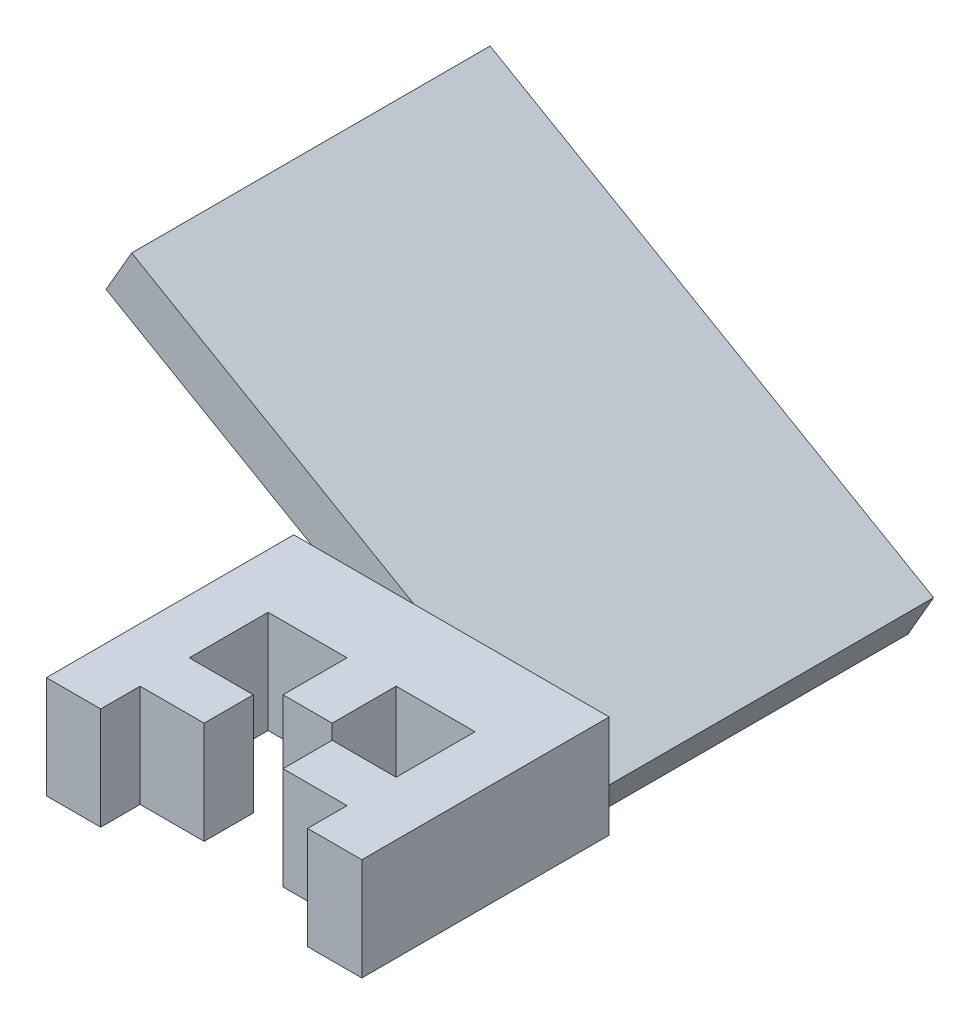
ISO-10303-21;
HEADER;
FILE_DESCRIPTION(('STEP AP214'),'2;1');
FILE_NAME('part.step','',(''),(''),'','','');
FILE_SCHEMA(('AUTOMOTIVE_DESIGN { 1 0 10303 214 1 1 1 1 }'));
ENDSEC;
DATA;
#1=APPLICATION_CONTEXT('core data for automotive mechanical design processes');
#2=APPLICATION_PROTOCOL_DEFINITION('international standard','automotive_design',2000,#1);
#3=PRODUCT_CONTEXT('',#1,'mechanical');
#4=PRODUCT('Part','Part','',(#3));
#5=PRODUCT_RELATED_PRODUCT_CATEGORY('part','',(#4));
#6=PRODUCT_DEFINITION_FORMATION('','',#4);
#7=PRODUCT_DEFINITION_CONTEXT('part definition',#1,'design');
#8=PRODUCT_DEFINITION('design','',#6,#7);
#9=PRODUCT_DEFINITION_SHAPE('','',#8);
#10=(LENGTH_UNIT() NAMED_UNIT(*) SI_UNIT(.MILLI.,.METRE.));
#11=(NAMED_UNIT(*) PLANE_ANGLE_UNIT() SI_UNIT($,.RADIAN.));
#12=(NAMED_UNIT(*) SI_UNIT($,.STERADIAN.) SOLID_ANGLE_UNIT());
#13=UNCERTAINTY_MEASURE_WITH_UNIT(LENGTH_MEASURE(1.E-05),#10,'distance_accuracy_value','');
#14=(GEOMETRIC_REPRESENTATION_CONTEXT(3) GLOBAL_UNCERTAINTY_ASSIGNED_CONTEXT((#13)) GLOBAL_UNIT_ASSIGNED_CONTEXT((#10,
#11,#12)) REPRESENTATION_CONTEXT('',''));
#15=CARTESIAN_POINT('',(0.,0.,0.));
#16=DIRECTION('',(0.,0.,1.));
#17=DIRECTION('',(1.,0.,0.));
#18=AXIS2_PLACEMENT_3D('',#15,#16,#17);
#19=CARTESIAN_POINT('',(-15.4,5.,-17.9));
#20=DIRECTION('',(0.,0.,-1.));
#21=DIRECTION('',(-1.,0.,0.));
#22=AXIS2_PLACEMENT_3D('',#19,#20,#21);
#23=PLANE('',#22);
#24=DIRECTION('',(-0.866025403784438,0.5,0.));
#25=VECTOR('',#24,1.);
#26=CARTESIAN_POINT('',(-33.7262701892219,16.59,-17.9));
#27=LINE('',#26,#25);
#28=CARTESIAN_POINT('',(3.66870674619011,-4.99999999999999,-17.9));
#29=VERTEX_POINT('',#28);
#30=CARTESIAN_POINT('',(-13.6518013294987,5.00000000000001,-17.9));
#31=VERTEX_POINT('',#30);
#32=EDGE_CURVE('E11',#29,#31,#27,.T.);
#33=ORIENTED_EDGE('',*,*,#32,.F.);
#34=DIRECTION('',(1.,0.,0.));
#35=VECTOR('',#34,1.);
#36=CARTESIAN_POINT('',(-15.4,-5.,-17.9));
#37=LINE('',#36,#35);
#38=CARTESIAN_POINT('',(-15.4,-5.,-17.9));
#39=VERTEX_POINT('',#38);
#40=EDGE_CURVE('E235',#39,#29,#37,.T.);
#41=ORIENTED_EDGE('',*,*,#40,.F.);
#42=DIRECTION('',(0.,-1.,0.));
#43=VECTOR('',#42,1.);
#44=CARTESIAN_POINT('',(-15.4,5.,-17.9));
#45=LINE('',#44,#43);
#46=CARTESIAN_POINT('',(-15.4,5.,-17.9));
#47=VERTEX_POINT('',#46);
#48=EDGE_CURVE('E242',#47,#39,#45,.T.);
#49=ORIENTED_EDGE('',*,*,#48,.F.);
#50=DIRECTION('',(1.,0.,0.));
#51=VECTOR('',#50,1.);
#52=CARTESIAN_POINT('',(-15.4,5.,-17.9));
#53=LINE('',#52,#51);
#54=EDGE_CURVE('E240',#47,#31,#53,.T.);
#55=ORIENTED_EDGE('',*,*,#54,.T.);
#56=EDGE_LOOP('',(#33,#41,#49,#55));
#57=FACE_BOUND('',#56,.T.);
#58=ADVANCED_FACE('F33',(#57),#23,.T.);
#59=CARTESIAN_POINT('',(-3.85,5.,2.4));
#60=DIRECTION('',(0.,0.,-1.));
#61=DIRECTION('',(-1.,0.,0.));
#62=AXIS2_PLACEMENT_3D('',#59,#60,#61);
#63=PLANE('',#62);
#64=DIRECTION('',(1.,0.,0.));
#65=VECTOR('',#64,1.);
#66=CARTESIAN_POINT('',(-3.85,-5.,2.4));
#67=LINE('',#66,#65);
#68=CARTESIAN_POINT('',(-10.1,-5.,2.4));
#69=VERTEX_POINT('',#68);
#70=CARTESIAN_POINT('',(-3.85,-5.,2.4));
#71=VERTEX_POINT('',#70);
#72=EDGE_CURVE('E250',#69,#71,#67,.T.);
#73=ORIENTED_EDGE('',*,*,#72,.T.);
#74=DIRECTION('',(0.,-1.,0.));
#75=VECTOR('',#74,1.);
#76=CARTESIAN_POINT('',(-3.85,5.,2.4));
#77=LINE('',#76,#75);
#78=CARTESIAN_POINT('',(-3.85,5.,2.4));
#79=VERTEX_POINT('',#78);
#80=EDGE_CURVE('E37',#79,#71,#77,.T.);
#81=ORIENTED_EDGE('',*,*,#80,.F.);
#82=DIRECTION('',(1.,0.,0.));
#83=VECTOR('',#82,1.);
#84=CARTESIAN_POINT('',(-3.85,5.,2.4));
#85=LINE('',#84,#83);
#86=CARTESIAN_POINT('',(-10.1,5.,2.4));
#87=VERTEX_POINT('',#86);
#88=EDGE_CURVE('E253',#87,#79,#85,.T.);
#89=ORIENTED_EDGE('',*,*,#88,.F.);
#90=DIRECTION('',(0.,-1.,0.));
#91=VECTOR('',#90,1.);
#92=CARTESIAN_POINT('',(-10.1,5.,2.4));
#93=LINE('',#92,#91);
#94=EDGE_CURVE('E294',#87,#69,#93,.T.);
#95=ORIENTED_EDGE('',*,*,#94,.T.);
#96=EDGE_LOOP('',(#73,#81,#89,#95));
#97=FACE_BOUND('',#96,.T.);
#98=ADVANCED_FACE('F35',(#97),#63,.F.);
#99=CARTESIAN_POINT('',(-3.85,5.,2.4));
#100=DIRECTION('',(-1.,0.,0.));
#101=DIRECTION('',(0.,0.,1.));
#102=AXIS2_PLACEMENT_3D('',#99,#100,#101);
#103=PLANE('',#102);
#104=DIRECTION('',(0.,0.,-1.));
#105=VECTOR('',#104,1.);
#106=CARTESIAN_POINT('',(-3.85,-5.,2.4));
#107=LINE('',#106,#105);
#108=CARTESIAN_POINT('',(-3.85,-5.,-2.4));
#109=VERTEX_POINT('',#108);
#110=EDGE_CURVE('E297',#71,#109,#107,.T.);
#111=ORIENTED_EDGE('',*,*,#110,.T.);
#112=DIRECTION('',(0.,-1.,0.));
#113=VECTOR('',#112,1.);
#114=CARTESIAN_POINT('',(-3.85,5.,-2.4));
#115=LINE('',#114,#113);
#116=CARTESIAN_POINT('',(-3.85,5.,-2.4));
#117=VERTEX_POINT('',#116);
#118=EDGE_CURVE('E379',#117,#109,#115,.T.);
#119=ORIENTED_EDGE('',*,*,#118,.F.);
#120=DIRECTION('',(0.,0.,-1.));
#121=VECTOR('',#120,1.);
#122=CARTESIAN_POINT('',(-3.85,5.,2.4));
#123=LINE('',#122,#121);
#124=EDGE_CURVE('E256',#79,#117,#123,.T.);
#125=ORIENTED_EDGE('',*,*,#124,.F.);
#126=ORIENTED_EDGE('',*,*,#80,.T.);
#127=EDGE_LOOP('',(#111,#119,#125,#126));
#128=FACE_BOUND('',#127,.T.);
#129=ADVANCED_FACE('F450',(#128),#103,.F.);
#130=CARTESIAN_POINT('',(-3.85,5.,-2.4));
#131=DIRECTION('',(0.,0.,1.));
#132=DIRECTION('',(1.,0.,0.));
#133=AXIS2_PLACEMENT_3D('',#130,#131,#132);
#134=PLANE('',#133);
#135=DIRECTION('',(-1.,0.,0.));
#136=VECTOR('',#135,1.);
#137=CARTESIAN_POINT('',(-3.85,-5.,-2.4));
#138=LINE('',#137,#136);
#139=CARTESIAN_POINT('',(-10.1,-5.,-2.4));
#140=VERTEX_POINT('',#139);
#141=EDGE_CURVE('E299',#109,#140,#138,.T.);
#142=ORIENTED_EDGE('',*,*,#141,.T.);
#143=DIRECTION('',(0.,-1.,0.));
#144=VECTOR('',#143,1.);
#145=CARTESIAN_POINT('',(-10.1,5.,-2.4));
#146=LINE('',#145,#144);
#147=CARTESIAN_POINT('',(-10.1,5.,-2.4));
#148=VERTEX_POINT('',#147);
#149=EDGE_CURVE('E377',#148,#140,#146,.T.);
#150=ORIENTED_EDGE('',*,*,#149,.F.);
#151=DIRECTION('',(-1.,0.,0.));
#152=VECTOR('',#151,1.);
#153=CARTESIAN_POINT('',(-3.85,5.,-2.4));
#154=LINE('',#153,#152);
#155=EDGE_CURVE('E259',#117,#148,#154,.T.);
#156=ORIENTED_EDGE('',*,*,#155,.F.);
#157=ORIENTED_EDGE('',*,*,#118,.T.);
#158=EDGE_LOOP('',(#142,#150,#156,#157));
#159=FACE_BOUND('',#158,.T.);
#160=ADVANCED_FACE('F452',(#159),#134,.F.);
#161=CARTESIAN_POINT('',(-10.1,5.,-2.4));
#162=DIRECTION('',(-1.,0.,0.));
#163=DIRECTION('',(0.,0.,1.));
#164=AXIS2_PLACEMENT_3D('',#161,#162,#163);
#165=PLANE('',#164);
#166=DIRECTION('',(0.,0.,-1.));
#167=VECTOR('',#166,1.);
#168=CARTESIAN_POINT('',(-10.1,-5.,-2.4));
#169=LINE('',#168,#167);
#170=CARTESIAN_POINT('',(-10.1,-5.,-10.1));
#171=VERTEX_POINT('',#170);
#172=EDGE_CURVE('E301',#140,#171,#169,.T.);
#173=ORIENTED_EDGE('',*,*,#172,.T.);
#174=DIRECTION('',(0.,-1.,0.));
#175=VECTOR('',#174,1.);
#176=CARTESIAN_POINT('',(-10.1,5.,-10.1));
#177=LINE('',#176,#175);
#178=CARTESIAN_POINT('',(-10.1,5.,-10.1));
#179=VERTEX_POINT('',#178);
#180=EDGE_CURVE('E374',#179,#171,#177,.T.);
#181=ORIENTED_EDGE('',*,*,#180,.F.);
#182=DIRECTION('',(0.,0.,-1.));
#183=VECTOR('',#182,1.);
#184=CARTESIAN_POINT('',(-10.1,5.,-2.4));
#185=LINE('',#184,#183);
#186=EDGE_CURVE('E261',#148,#179,#185,.T.);
#187=ORIENTED_EDGE('',*,*,#186,.F.);
#188=ORIENTED_EDGE('',*,*,#149,.T.);
#189=EDGE_LOOP('',(#173,#181,#187,#188));
#190=FACE_BOUND('',#189,.T.);
#191=ADVANCED_FACE('F458',(#190),#165,.F.);
#192=CARTESIAN_POINT('',(-10.1,5.,-10.1));
#193=DIRECTION('',(0.,0.,-1.));
#194=DIRECTION('',(-1.,0.,0.));
#195=AXIS2_PLACEMENT_3D('',#192,#193,#194);
#196=PLANE('',#195);
#197=DIRECTION('',(1.,0.,0.));
#198=VECTOR('',#197,1.);
#199=CARTESIAN_POINT('',(-10.1,-5.,-10.1));
#200=LINE('',#199,#198);
#201=CARTESIAN_POINT('',(-2.4,-5.,-10.1));
#202=VERTEX_POINT('',#201);
#203=EDGE_CURVE('E303',#171,#202,#200,.T.);
#204=ORIENTED_EDGE('',*,*,#203,.T.);
#205=DIRECTION('',(0.,-1.,0.));
#206=VECTOR('',#205,1.);
#207=CARTESIAN_POINT('',(-2.4,5.,-10.1));
#208=LINE('',#207,#206);
#209=CARTESIAN_POINT('',(-2.4,5.,-10.1));
#210=VERTEX_POINT('',#209);
#211=EDGE_CURVE('E371',#210,#202,#208,.T.);
#212=ORIENTED_EDGE('',*,*,#211,.F.);
#213=DIRECTION('',(1.,0.,0.));
#214=VECTOR('',#213,1.);
#215=CARTESIAN_POINT('',(-10.1,5.,-10.1));
#216=LINE('',#215,#214);
#217=EDGE_CURVE('E263',#179,#210,#216,.T.);
#218=ORIENTED_EDGE('',*,*,#217,.F.);
#219=ORIENTED_EDGE('',*,*,#180,.T.);
#220=EDGE_LOOP('',(#204,#212,#218,#219));
#221=FACE_BOUND('',#220,.T.);
#222=ADVANCED_FACE('F461',(#221),#196,.F.);
#223=CARTESIAN_POINT('',(-2.4,5.,-10.1));
#224=DIRECTION('',(1.,0.,0.));
#225=DIRECTION('',(0.,0.,-1.));
#226=AXIS2_PLACEMENT_3D('',#223,#224,#225);
#227=PLANE('',#226);
#228=DIRECTION('',(0.,0.,1.));
#229=VECTOR('',#228,1.);
#230=CARTESIAN_POINT('',(-2.4,-5.,-10.1));
#231=LINE('',#230,#229);
#232=CARTESIAN_POINT('',(-2.4,-5.,-3.85));
#233=VERTEX_POINT('',#232);
#234=EDGE_CURVE('E305',#202,#233,#231,.T.);
#235=ORIENTED_EDGE('',*,*,#234,.T.);
#236=DIRECTION('',(0.,-1.,0.));
#237=VECTOR('',#236,1.);
#238=CARTESIAN_POINT('',(-2.4,5.,-3.85));
#239=LINE('',#238,#237);
#240=CARTESIAN_POINT('',(-2.4,5.,-3.85));
#241=VERTEX_POINT('',#240);
#242=EDGE_CURVE('E368',#241,#233,#239,.T.);
#243=ORIENTED_EDGE('',*,*,#242,.F.);
#244=DIRECTION('',(0.,0.,1.));
#245=VECTOR('',#244,1.);
#246=CARTESIAN_POINT('',(-2.4,5.,-10.1));
#247=LINE('',#246,#245);
#248=EDGE_CURVE('E265',#210,#241,#247,.T.);
#249=ORIENTED_EDGE('',*,*,#248,.F.);
#250=ORIENTED_EDGE('',*,*,#211,.T.);
#251=EDGE_LOOP('',(#235,#243,#249,#250));
#252=FACE_BOUND('',#251,.T.);
#253=ADVANCED_FACE('F466',(#252),#227,.F.);
#254=CARTESIAN_POINT('',(-2.4,5.,-3.85));
#255=DIRECTION('',(0.,0.,-1.));
#256=DIRECTION('',(-1.,0.,0.));
#257=AXIS2_PLACEMENT_3D('',#254,#255,#256);
#258=PLANE('',#257);
#259=DIRECTION('',(1.,0.,0.));
#260=VECTOR('',#259,1.);
#261=CARTESIAN_POINT('',(-2.4,-5.,-3.85));
#262=LINE('',#261,#260);
#263=CARTESIAN_POINT('',(2.4,-5.,-3.85));
#264=VERTEX_POINT('',#263);
#265=EDGE_CURVE('E307',#233,#264,#262,.T.);
#266=ORIENTED_EDGE('',*,*,#265,.T.);
#267=DIRECTION('',(0.,-1.,0.));
#268=VECTOR('',#267,1.);
#269=CARTESIAN_POINT('',(2.4,5.,-3.85));
#270=LINE('',#269,#268);
#271=CARTESIAN_POINT('',(2.4,5.,-3.85));
#272=VERTEX_POINT('',#271);
#273=EDGE_CURVE('E365',#272,#264,#270,.T.);
#274=ORIENTED_EDGE('',*,*,#273,.F.);
#275=DIRECTION('',(1.,0.,0.));
#276=VECTOR('',#275,1.);
#277=CARTESIAN_POINT('',(-2.4,5.,-3.85));
#278=LINE('',#277,#276);
#279=EDGE_CURVE('E267',#241,#272,#278,.T.);
#280=ORIENTED_EDGE('',*,*,#279,.F.);
#281=ORIENTED_EDGE('',*,*,#242,.T.);
#282=EDGE_LOOP('',(#266,#274,#280,#281));
#283=FACE_BOUND('',#282,.T.);
#284=ADVANCED_FACE('F472',(#283),#258,.F.);
#285=CARTESIAN_POINT('',(2.4,5.,-10.1));
#286=DIRECTION('',(-1.,0.,0.));
#287=DIRECTION('',(0.,0.,1.));
#288=AXIS2_PLACEMENT_3D('',#285,#286,#287);
#289=PLANE('',#288);
#290=DIRECTION('',(0.,0.,-1.));
#291=VECTOR('',#290,1.);
#292=CARTESIAN_POINT('',(2.4,-5.,-10.1));
#293=LINE('',#292,#291);
#294=CARTESIAN_POINT('',(2.4,-5.,-10.1));
#295=VERTEX_POINT('',#294);
#296=EDGE_CURVE('E309',#264,#295,#293,.T.);
#297=ORIENTED_EDGE('',*,*,#296,.T.);
#298=DIRECTION('',(0.,-1.,0.));
#299=VECTOR('',#298,1.);
#300=CARTESIAN_POINT('',(2.4,5.,-10.1));
#301=LINE('',#300,#299);
#302=CARTESIAN_POINT('',(2.4,5.,-10.1));
#303=VERTEX_POINT('',#302);
#304=EDGE_CURVE('E362',#303,#295,#301,.T.);
#305=ORIENTED_EDGE('',*,*,#304,.F.);
#306=DIRECTION('',(0.,0.,-1.));
#307=VECTOR('',#306,1.);
#308=CARTESIAN_POINT('',(2.4,5.,-10.1));
#309=LINE('',#308,#307);
#310=EDGE_CURVE('E269',#272,#303,#309,.T.);
#311=ORIENTED_EDGE('',*,*,#310,.F.);
#312=ORIENTED_EDGE('',*,*,#273,.T.);
#313=EDGE_LOOP('',(#297,#305,#311,#312));
#314=FACE_BOUND('',#313,.T.);
#315=ADVANCED_FACE('F476',(#314),#289,.F.);
#316=CARTESIAN_POINT('',(10.1,5.,-10.1));
#317=DIRECTION('',(0.,0.,-1.));
#318=DIRECTION('',(-1.,0.,0.));
#319=AXIS2_PLACEMENT_3D('',#316,#317,#318);
#320=PLANE('',#319);
#321=DIRECTION('',(1.,0.,0.));
#322=VECTOR('',#321,1.);
#323=CARTESIAN_POINT('',(10.1,-5.,-10.1));
#324=LINE('',#323,#322);
#325=CARTESIAN_POINT('',(10.1,-5.,-10.1));
#326=VERTEX_POINT('',#325);
#327=EDGE_CURVE('E311',#295,#326,#324,.T.);
#328=ORIENTED_EDGE('',*,*,#327,.T.);
#329=DIRECTION('',(0.,-1.,0.));
#330=VECTOR('',#329,1.);
#331=CARTESIAN_POINT('',(10.1,5.,-10.1));
#332=LINE('',#331,#330);
#333=CARTESIAN_POINT('',(10.1,5.,-10.1));
#334=VERTEX_POINT('',#333);
#335=EDGE_CURVE('E359',#334,#326,#332,.T.);
#336=ORIENTED_EDGE('',*,*,#335,.F.);
#337=DIRECTION('',(1.,0.,0.));
#338=VECTOR('',#337,1.);
#339=CARTESIAN_POINT('',(10.1,5.,-10.1));
#340=LINE('',#339,#338);
#341=EDGE_CURVE('E271',#303,#334,#340,.T.);
#342=ORIENTED_EDGE('',*,*,#341,.F.);
#343=ORIENTED_EDGE('',*,*,#304,.T.);
#344=EDGE_LOOP('',(#328,#336,#342,#343));
#345=FACE_BOUND('',#344,.T.);
#346=ADVANCED_FACE('F481',(#345),#320,.F.);
#347=CARTESIAN_POINT('',(10.1,5.,-2.4));
#348=DIRECTION('',(1.,0.,0.));
#349=DIRECTION('',(0.,0.,-1.));
#350=AXIS2_PLACEMENT_3D('',#347,#348,#349);
#351=PLANE('',#350);
#352=DIRECTION('',(0.,0.,1.));
#353=VECTOR('',#352,1.);
#354=CARTESIAN_POINT('',(10.1,-5.,-2.4));
#355=LINE('',#354,#353);
#356=CARTESIAN_POINT('',(10.1,-5.,-2.4));
#357=VERTEX_POINT('',#356);
#358=EDGE_CURVE('E313',#326,#357,#355,.T.);
#359=ORIENTED_EDGE('',*,*,#358,.T.);
#360=DIRECTION('',(0.,-1.,0.));
#361=VECTOR('',#360,1.);
#362=CARTESIAN_POINT('',(10.1,5.,-2.4));
#363=LINE('',#362,#361);
#364=CARTESIAN_POINT('',(10.1,5.,-2.4));
#365=VERTEX_POINT('',#364);
#366=EDGE_CURVE('E356',#365,#357,#363,.T.);
#367=ORIENTED_EDGE('',*,*,#366,.F.);
#368=DIRECTION('',(0.,0.,1.));
#369=VECTOR('',#368,1.);
#370=CARTESIAN_POINT('',(10.1,5.,-2.4));
#371=LINE('',#370,#369);
#372=EDGE_CURVE('E273',#334,#365,#371,.T.);
#373=ORIENTED_EDGE('',*,*,#372,.F.);
#374=ORIENTED_EDGE('',*,*,#335,.T.);
#375=EDGE_LOOP('',(#359,#367,#373,#374));
#376=FACE_BOUND('',#375,.T.);
#377=ADVANCED_FACE('F487',(#376),#351,.F.);
#378=CARTESIAN_POINT('',(3.85,5.,-2.4));
#379=DIRECTION('',(0.,0.,1.));
#380=DIRECTION('',(1.,0.,0.));
#381=AXIS2_PLACEMENT_3D('',#378,#379,#380);
#382=PLANE('',#381);
#383=DIRECTION('',(-1.,0.,0.));
#384=VECTOR('',#383,1.);
#385=CARTESIAN_POINT('',(3.85,-5.,-2.4));
#386=LINE('',#385,#384);
#387=CARTESIAN_POINT('',(3.85,-5.,-2.4));
#388=VERTEX_POINT('',#387);
#389=EDGE_CURVE('E315',#357,#388,#386,.T.);
#390=ORIENTED_EDGE('',*,*,#389,.T.);
#391=DIRECTION('',(0.,-1.,0.));
#392=VECTOR('',#391,1.);
#393=CARTESIAN_POINT('',(3.85,5.,-2.4));
#394=LINE('',#393,#392);
#395=CARTESIAN_POINT('',(3.85,5.,-2.4));
#396=VERTEX_POINT('',#395);
#397=EDGE_CURVE('E353',#396,#388,#394,.T.);
#398=ORIENTED_EDGE('',*,*,#397,.F.);
#399=DIRECTION('',(-1.,0.,0.));
#400=VECTOR('',#399,1.);
#401=CARTESIAN_POINT('',(3.85,5.,-2.4));
#402=LINE('',#401,#400);
#403=EDGE_CURVE('E275',#365,#396,#402,.T.);
#404=ORIENTED_EDGE('',*,*,#403,.F.);
#405=ORIENTED_EDGE('',*,*,#366,.T.);
#406=EDGE_LOOP('',(#390,#398,#404,#405));
#407=FACE_BOUND('',#406,.T.);
#408=ADVANCED_FACE('F491',(#407),#382,.F.);
#409=CARTESIAN_POINT('',(3.85,5.,2.4));
#410=DIRECTION('',(1.,0.,0.));
#411=DIRECTION('',(0.,0.,-1.));
#412=AXIS2_PLACEMENT_3D('',#409,#410,#411);
#413=PLANE('',#412);
#414=DIRECTION('',(0.,0.,1.));
#415=VECTOR('',#414,1.);
#416=CARTESIAN_POINT('',(3.85,-5.,2.4));
#417=LINE('',#416,#415);
#418=CARTESIAN_POINT('',(3.85,-5.,2.4));
#419=VERTEX_POINT('',#418);
#420=EDGE_CURVE('E317',#388,#419,#417,.T.);
#421=ORIENTED_EDGE('',*,*,#420,.T.);
#422=DIRECTION('',(0.,-1.,0.));
#423=VECTOR('',#422,1.);
#424=CARTESIAN_POINT('',(3.85,5.,2.4));
#425=LINE('',#424,#423);
#426=CARTESIAN_POINT('',(3.85,5.,2.4));
#427=VERTEX_POINT('',#426);
#428=EDGE_CURVE('E350',#427,#419,#425,.T.);
#429=ORIENTED_EDGE('',*,*,#428,.F.);
#430=DIRECTION('',(0.,0.,1.));
#431=VECTOR('',#430,1.);
#432=CARTESIAN_POINT('',(3.85,5.,2.4));
#433=LINE('',#432,#431);
#434=EDGE_CURVE('E277',#396,#427,#433,.T.);
#435=ORIENTED_EDGE('',*,*,#434,.F.);
#436=ORIENTED_EDGE('',*,*,#397,.T.);
#437=EDGE_LOOP('',(#421,#429,#435,#436));
#438=FACE_BOUND('',#437,.T.);
#439=ADVANCED_FACE('F496',(#438),#413,.F.);
#440=CARTESIAN_POINT('',(3.85,5.,2.4));
#441=DIRECTION('',(0.,0.,-1.));
#442=DIRECTION('',(-1.,0.,0.));
#443=AXIS2_PLACEMENT_3D('',#440,#441,#442);
#444=PLANE('',#443);
#445=DIRECTION('',(1.,0.,0.));
#446=VECTOR('',#445,1.);
#447=CARTESIAN_POINT('',(3.85,-5.,2.4));
#448=LINE('',#447,#446);
#449=CARTESIAN_POINT('',(10.1,-5.,2.4));
#450=VERTEX_POINT('',#449);
#451=EDGE_CURVE('E319',#419,#450,#448,.T.);
#452=ORIENTED_EDGE('',*,*,#451,.T.);
#453=DIRECTION('',(0.,-1.,0.));
#454=VECTOR('',#453,1.);
#455=CARTESIAN_POINT('',(10.1,5.,2.4));
#456=LINE('',#455,#454);
#457=CARTESIAN_POINT('',(10.1,5.,2.4));
#458=VERTEX_POINT('',#457);
#459=EDGE_CURVE('E347',#458,#450,#456,.T.);
#460=ORIENTED_EDGE('',*,*,#459,.F.);
#461=DIRECTION('',(1.,0.,0.));
#462=VECTOR('',#461,1.);
#463=CARTESIAN_POINT('',(3.85,5.,2.4));
#464=LINE('',#463,#462);
#465=EDGE_CURVE('E279',#427,#458,#464,.T.);
#466=ORIENTED_EDGE('',*,*,#465,.F.);
#467=ORIENTED_EDGE('',*,*,#428,.T.);
#468=EDGE_LOOP('',(#452,#460,#466,#467));
#469=FACE_BOUND('',#468,.T.);
#470=ADVANCED_FACE('F502',(#469),#444,.F.);
#471=CARTESIAN_POINT('',(10.1,5.,2.4));
#472=DIRECTION('',(1.,0.,0.));
#473=DIRECTION('',(0.,0.,-1.));
#474=AXIS2_PLACEMENT_3D('',#471,#472,#473);
#475=PLANE('',#474);
#476=DIRECTION('',(0.,0.,1.));
#477=VECTOR('',#476,1.);
#478=CARTESIAN_POINT('',(10.1,-5.,2.4));
#479=LINE('',#478,#477);
#480=CARTESIAN_POINT('',(10.1,-5.,6.25));
#481=VERTEX_POINT('',#480);
#482=EDGE_CURVE('E321',#450,#481,#479,.T.);
#483=ORIENTED_EDGE('',*,*,#482,.T.);
#484=DIRECTION('',(0.,-1.,0.));
#485=VECTOR('',#484,1.);
#486=CARTESIAN_POINT('',(10.1,5.,6.25));
#487=LINE('',#486,#485);
#488=CARTESIAN_POINT('',(10.1,5.,6.25));
#489=VERTEX_POINT('',#488);
#490=EDGE_CURVE('E344',#489,#481,#487,.T.);
#491=ORIENTED_EDGE('',*,*,#490,.F.);
#492=DIRECTION('',(0.,0.,1.));
#493=VECTOR('',#492,1.);
#494=CARTESIAN_POINT('',(10.1,5.,2.4));
#495=LINE('',#494,#493);
#496=EDGE_CURVE('E281',#458,#489,#495,.T.);
#497=ORIENTED_EDGE('',*,*,#496,.F.);
#498=ORIENTED_EDGE('',*,*,#459,.T.);
#499=EDGE_LOOP('',(#483,#491,#497,#498));
#500=FACE_BOUND('',#499,.T.);
#501=ADVANCED_FACE('F505',(#500),#475,.F.);
#502=CARTESIAN_POINT('',(10.1,5.,6.25));
#503=DIRECTION('',(0.,0.,-1.));
#504=DIRECTION('',(-1.,0.,0.));
#505=AXIS2_PLACEMENT_3D('',#502,#503,#504);
#506=PLANE('',#505);
#507=DIRECTION('',(1.,0.,0.));
#508=VECTOR('',#507,1.);
#509=CARTESIAN_POINT('',(10.1,-5.,6.25));
#510=LINE('',#509,#508);
#511=CARTESIAN_POINT('',(15.4,-5.,6.25));
#512=VERTEX_POINT('',#511);
#513=EDGE_CURVE('E323',#481,#512,#510,.T.);
#514=ORIENTED_EDGE('',*,*,#513,.T.);
#515=DIRECTION('',(0.,-1.,0.));
#516=VECTOR('',#515,1.);
#517=CARTESIAN_POINT('',(15.4,5.,6.25));
#518=LINE('',#517,#516);
#519=CARTESIAN_POINT('',(15.4,5.,6.25));
#520=VERTEX_POINT('',#519);
#521=EDGE_CURVE('E341',#520,#512,#518,.T.);
#522=ORIENTED_EDGE('',*,*,#521,.F.);
#523=DIRECTION('',(1.,0.,0.));
#524=VECTOR('',#523,1.);
#525=CARTESIAN_POINT('',(10.1,5.,6.25));
#526=LINE('',#525,#524);
#527=EDGE_CURVE('E283',#489,#520,#526,.T.);
#528=ORIENTED_EDGE('',*,*,#527,.F.);
#529=ORIENTED_EDGE('',*,*,#490,.T.);
#530=EDGE_LOOP('',(#514,#522,#528,#529));
#531=FACE_BOUND('',#530,.T.);
#532=ADVANCED_FACE('F507',(#531),#506,.F.);
#533=CARTESIAN_POINT('',(15.4,5.,-15.4));
#534=DIRECTION('',(-1.,0.,0.));
#535=DIRECTION('',(0.,0.,1.));
#536=AXIS2_PLACEMENT_3D('',#533,#534,#535);
#537=PLANE('',#536);
#538=DIRECTION('',(0.,0.,-1.));
#539=VECTOR('',#538,1.);
#540=CARTESIAN_POINT('',(15.4,-5.,-15.4));
#541=LINE('',#540,#539);
#542=CARTESIAN_POINT('',(15.4,-5.,-17.9));
#543=VERTEX_POINT('',#542);
#544=EDGE_CURVE('E325',#512,#543,#541,.T.);
#545=ORIENTED_EDGE('',*,*,#544,.T.);
#546=DIRECTION('',(0.,-1.,0.));
#547=VECTOR('',#546,1.);
#548=CARTESIAN_POINT('',(15.4,5.,-17.9));
#549=LINE('',#548,#547);
#550=CARTESIAN_POINT('',(15.4,5.,-17.9));
#551=VERTEX_POINT('',#550);
#552=EDGE_CURVE('E247',#551,#543,#549,.T.);
#553=ORIENTED_EDGE('',*,*,#552,.F.);
#554=DIRECTION('',(0.,0.,-1.));
#555=VECTOR('',#554,1.);
#556=CARTESIAN_POINT('',(15.4,5.,-15.4));
#557=LINE('',#556,#555);
#558=EDGE_CURVE('E285',#520,#551,#557,.T.);
#559=ORIENTED_EDGE('',*,*,#558,.F.);
#560=ORIENTED_EDGE('',*,*,#521,.T.);
#561=EDGE_LOOP('',(#545,#553,#559,#560));
#562=FACE_BOUND('',#561,.T.);
#563=ADVANCED_FACE('F418',(#562),#537,.F.);
#564=CARTESIAN_POINT('',(-15.4,5.,-15.4));
#565=DIRECTION('',(1.,0.,0.));
#566=DIRECTION('',(0.,0.,-1.));
#567=AXIS2_PLACEMENT_3D('',#564,#565,#566);
#568=PLANE('',#567);
#569=DIRECTION('',(0.,0.,1.));
#570=VECTOR('',#569,1.);
#571=CARTESIAN_POINT('',(-15.4,-5.,-15.4));
#572=LINE('',#571,#570);
#573=CARTESIAN_POINT('',(-15.4,-5.,6.25));
#574=VERTEX_POINT('',#573);
#575=EDGE_CURVE('E328',#39,#574,#572,.T.);
#576=ORIENTED_EDGE('',*,*,#575,.T.);
#577=DIRECTION('',(0.,-1.,0.));
#578=VECTOR('',#577,1.);
#579=CARTESIAN_POINT('',(-15.4,5.,6.25));
#580=LINE('',#579,#578);
#581=CARTESIAN_POINT('',(-15.4,5.,6.25));
#582=VERTEX_POINT('',#581);
#583=EDGE_CURVE('E338',#582,#574,#580,.T.);
#584=ORIENTED_EDGE('',*,*,#583,.F.);
#585=DIRECTION('',(0.,0.,1.));
#586=VECTOR('',#585,1.);
#587=CARTESIAN_POINT('',(-15.4,5.,-15.4));
#588=LINE('',#587,#586);
#589=EDGE_CURVE('E288',#47,#582,#588,.T.);
#590=ORIENTED_EDGE('',*,*,#589,.F.);
#591=ORIENTED_EDGE('',*,*,#48,.T.);
#592=EDGE_LOOP('',(#576,#584,#590,#591));
#593=FACE_BOUND('',#592,.T.);
#594=ADVANCED_FACE('F438',(#593),#568,.F.);
#595=CARTESIAN_POINT('',(-10.1,5.,6.25));
#596=DIRECTION('',(0.,0.,-1.));
#597=DIRECTION('',(-1.,0.,0.));
#598=AXIS2_PLACEMENT_3D('',#595,#596,#597);
#599=PLANE('',#598);
#600=DIRECTION('',(1.,0.,0.));
#601=VECTOR('',#600,1.);
#602=CARTESIAN_POINT('',(-10.1,-5.,6.25));
#603=LINE('',#602,#601);
#604=CARTESIAN_POINT('',(-10.1,-5.,6.25));
#605=VERTEX_POINT('',#604);
#606=EDGE_CURVE('E330',#574,#605,#603,.T.);
#607=ORIENTED_EDGE('',*,*,#606,.T.);
#608=DIRECTION('',(0.,-1.,0.));
#609=VECTOR('',#608,1.);
#610=CARTESIAN_POINT('',(-10.1,5.,6.25));
#611=LINE('',#610,#609);
#612=CARTESIAN_POINT('',(-10.1,5.,6.25));
#613=VERTEX_POINT('',#612);
#614=EDGE_CURVE('E335',#613,#605,#611,.T.);
#615=ORIENTED_EDGE('',*,*,#614,.F.);
#616=DIRECTION('',(1.,0.,0.));
#617=VECTOR('',#616,1.);
#618=CARTESIAN_POINT('',(-10.1,5.,6.25));
#619=LINE('',#618,#617);
#620=EDGE_CURVE('E290',#582,#613,#619,.T.);
#621=ORIENTED_EDGE('',*,*,#620,.F.);
#622=ORIENTED_EDGE('',*,*,#583,.T.);
#623=EDGE_LOOP('',(#607,#615,#621,#622));
#624=FACE_BOUND('',#623,.T.);
#625=ADVANCED_FACE('F442',(#624),#599,.F.);
#626=CARTESIAN_POINT('',(-10.1,5.,2.4));
#627=DIRECTION('',(-1.,0.,0.));
#628=DIRECTION('',(0.,0.,1.));
#629=AXIS2_PLACEMENT_3D('',#626,#627,#628);
#630=PLANE('',#629);
#631=DIRECTION('',(0.,0.,-1.));
#632=VECTOR('',#631,1.);
#633=CARTESIAN_POINT('',(-10.1,-5.,2.4));
#634=LINE('',#633,#632);
#635=EDGE_CURVE('E257',#605,#69,#634,.T.);
#636=ORIENTED_EDGE('',*,*,#635,.T.);
#637=ORIENTED_EDGE('',*,*,#94,.F.);
#638=DIRECTION('',(0.,0.,-1.));
#639=VECTOR('',#638,1.);
#640=CARTESIAN_POINT('',(-10.1,5.,2.4));
#641=LINE('',#640,#639);
#642=EDGE_CURVE('E292',#613,#87,#641,.T.);
#643=ORIENTED_EDGE('',*,*,#642,.F.);
#644=ORIENTED_EDGE('',*,*,#614,.T.);
#645=EDGE_LOOP('',(#636,#637,#643,#644));
#646=FACE_BOUND('',#645,.T.);
#647=ADVANCED_FACE('F446',(#646),#630,.F.);
#648=CARTESIAN_POINT('',(0.,5.,0.));
#649=DIRECTION('',(0.,1.,0.));
#650=DIRECTION('',(0.,0.,1.));
#651=AXIS2_PLACEMENT_3D('',#648,#649,#650);
#652=PLANE('',#651);
#653=ORIENTED_EDGE('',*,*,#88,.T.);
#654=ORIENTED_EDGE('',*,*,#124,.T.);
#655=ORIENTED_EDGE('',*,*,#155,.T.);
#656=ORIENTED_EDGE('',*,*,#186,.T.);
#657=ORIENTED_EDGE('',*,*,#217,.T.);
#658=ORIENTED_EDGE('',*,*,#248,.T.);
#659=ORIENTED_EDGE('',*,*,#279,.T.);
#660=ORIENTED_EDGE('',*,*,#310,.T.);
#661=ORIENTED_EDGE('',*,*,#341,.T.);
#662=ORIENTED_EDGE('',*,*,#372,.T.);
#663=ORIENTED_EDGE('',*,*,#403,.T.);
#664=ORIENTED_EDGE('',*,*,#434,.T.);
#665=ORIENTED_EDGE('',*,*,#465,.T.);
#666=ORIENTED_EDGE('',*,*,#496,.T.);
#667=ORIENTED_EDGE('',*,*,#527,.T.);
#668=ORIENTED_EDGE('',*,*,#558,.T.);
#669=CARTESIAN_POINT('',(-3.65180132949864,5.,-17.9));
#670=VERTEX_POINT('',#669);
#671=EDGE_CURVE('E244',#670,#551,#53,.T.);
#672=ORIENTED_EDGE('',*,*,#671,.F.);
#673=EDGE_CURVE('E243',#31,#670,#53,.T.);
#674=ORIENTED_EDGE('',*,*,#673,.F.);
#675=ORIENTED_EDGE('',*,*,#54,.F.);
#676=ORIENTED_EDGE('',*,*,#589,.T.);
#677=ORIENTED_EDGE('',*,*,#620,.T.);
#678=ORIENTED_EDGE('',*,*,#642,.T.);
#679=EDGE_LOOP('',(#653,#654,#655,#656,#657,#658,#659,#660,#661,#662,#663,#664,#665,#666,#667,
#668,#672,#674,#675,#676,#677,#678));
#680=FACE_BOUND('',#679,.T.);
#681=ADVANCED_FACE('F414',(#680),#652,.T.);
#682=CARTESIAN_POINT('',(0.,-5.,0.));
#683=DIRECTION('',(0.,1.,0.));
#684=DIRECTION('',(0.,0.,1.));
#685=AXIS2_PLACEMENT_3D('',#682,#683,#684);
#686=PLANE('',#685);
#687=ORIENTED_EDGE('',*,*,#72,.F.);
#688=ORIENTED_EDGE('',*,*,#635,.F.);
#689=ORIENTED_EDGE('',*,*,#606,.F.);
#690=ORIENTED_EDGE('',*,*,#575,.F.);
#691=ORIENTED_EDGE('',*,*,#40,.T.);
#692=CARTESIAN_POINT('',(11.5437644179366,-5.,-17.9));
#693=VERTEX_POINT('',#692);
#694=EDGE_CURVE('E233',#29,#693,#37,.T.);
#695=ORIENTED_EDGE('',*,*,#694,.T.);
#696=EDGE_CURVE('E231',#693,#543,#37,.T.);
#697=ORIENTED_EDGE('',*,*,#696,.T.);
#698=ORIENTED_EDGE('',*,*,#544,.F.);
#699=ORIENTED_EDGE('',*,*,#513,.F.);
#700=ORIENTED_EDGE('',*,*,#482,.F.);
#701=ORIENTED_EDGE('',*,*,#451,.F.);
#702=ORIENTED_EDGE('',*,*,#420,.F.);
#703=ORIENTED_EDGE('',*,*,#389,.F.);
#704=ORIENTED_EDGE('',*,*,#358,.F.);
#705=ORIENTED_EDGE('',*,*,#327,.F.);
#706=ORIENTED_EDGE('',*,*,#296,.F.);
#707=ORIENTED_EDGE('',*,*,#265,.F.);
#708=ORIENTED_EDGE('',*,*,#234,.F.);
#709=ORIENTED_EDGE('',*,*,#203,.F.);
#710=ORIENTED_EDGE('',*,*,#172,.F.);
#711=ORIENTED_EDGE('',*,*,#141,.F.);
#712=ORIENTED_EDGE('',*,*,#110,.F.);
#713=EDGE_LOOP('',(#687,#688,#689,#690,#691,#695,#697,#698,#699,#700,#701,#702,#703,#704,#705,
#706,#707,#708,#709,#710,#711,#712));
#714=FACE_BOUND('',#713,.T.);
#715=ADVANCED_FACE('F423',(#714),#686,.F.);
#716=DIRECTION('',(0.866025403784439,-0.5,0.));
#717=VECTOR('',#716,1.);
#718=CARTESIAN_POINT('',(-31.2262701892219,20.9201270189222,-17.9));
#719=LINE('',#718,#717);
#720=CARTESIAN_POINT('',(12.075,-4.07987298107781,-17.9));
#721=VERTEX_POINT('',#720);
#722=EDGE_CURVE('E42',#670,#721,#719,.T.);
#723=ORIENTED_EDGE('',*,*,#722,.F.);
#724=ORIENTED_EDGE('',*,*,#671,.T.);
#725=ORIENTED_EDGE('',*,*,#552,.T.);
#726=ORIENTED_EDGE('',*,*,#696,.F.);
#727=DIRECTION('',(-0.500000000000002,-0.866025403784438,0.));
#728=VECTOR('',#727,1.);
#729=CARTESIAN_POINT('',(12.075,-4.07987298107781,-17.9));
#730=LINE('',#729,#728);
#731=EDGE_CURVE('E52',#721,#693,#730,.T.);
#732=ORIENTED_EDGE('',*,*,#731,.F.);
#733=EDGE_LOOP('',(#723,#724,#725,#726,#732));
#734=FACE_BOUND('',#733,.T.);
#735=ADVANCED_FACE('F411',(#734),#23,.T.);
#736=CARTESIAN_POINT('',(0.,0.,-17.9));
#737=DIRECTION('',(0.,0.,-1.));
#738=DIRECTION('',(-1.,0.,0.));
#739=AXIS2_PLACEMENT_3D('',#736,#737,#738);
#740=PLANE('',#739);
#741=CARTESIAN_POINT('',(-33.7262701892219,16.59,-17.9));
#742=VERTEX_POINT('',#741);
#743=EDGE_CURVE('E45',#31,#742,#27,.T.);
#744=ORIENTED_EDGE('',*,*,#743,.F.);
#745=ORIENTED_EDGE('',*,*,#673,.T.);
#746=CARTESIAN_POINT('',(-31.2262701892219,20.9201270189222,-17.9));
#747=VERTEX_POINT('',#746);
#748=EDGE_CURVE('E389',#747,#670,#719,.T.);
#749=ORIENTED_EDGE('',*,*,#748,.F.);
#750=DIRECTION('',(0.5,0.866025403784439,0.));
#751=VECTOR('',#750,1.);
#752=CARTESIAN_POINT('',(-31.2262701892219,20.9201270189222,-17.9));
#753=LINE('',#752,#751);
#754=EDGE_CURVE('E227',#742,#747,#753,.T.);
#755=ORIENTED_EDGE('',*,*,#754,.F.);
#756=EDGE_LOOP('',(#744,#745,#749,#755));
#757=FACE_BOUND('',#756,.T.);
#758=ADVANCED_FACE('F407',(#757),#740,.F.);
#759=CARTESIAN_POINT('',(-31.2262701892219,20.9201270189222,-52.9));
#760=DIRECTION('',(-0.5,-0.866025403784439,0.));
#761=DIRECTION('',(0.866025403784439,-0.5,0.));
#762=AXIS2_PLACEMENT_3D('',#759,#760,#761);
#763=PLANE('',#762);
#764=ORIENTED_EDGE('',*,*,#748,.T.);
#765=ORIENTED_EDGE('',*,*,#722,.T.);
#766=DIRECTION('',(0.,0.,1.));
#767=VECTOR('',#766,1.);
#768=CARTESIAN_POINT('',(12.075,-4.07987298107781,-52.9));
#769=LINE('',#768,#767);
#770=CARTESIAN_POINT('',(12.075,-4.07987298107781,-52.9));
#771=VERTEX_POINT('',#770);
#772=EDGE_CURVE('E212',#771,#721,#769,.T.);
#773=ORIENTED_EDGE('',*,*,#772,.F.);
#774=DIRECTION('',(0.866025403784439,-0.5,0.));
#775=VECTOR('',#774,1.);
#776=CARTESIAN_POINT('',(-31.2262701892219,20.9201270189222,-52.9));
#777=LINE('',#776,#775);
#778=CARTESIAN_POINT('',(-31.2262701892219,20.9201270189222,-52.9));
#779=VERTEX_POINT('',#778);
#780=EDGE_CURVE('E218',#779,#771,#777,.T.);
#781=ORIENTED_EDGE('',*,*,#780,.F.);
#782=DIRECTION('',(0.,0.,1.));
#783=VECTOR('',#782,1.);
#784=CARTESIAN_POINT('',(-31.2262701892219,20.9201270189222,-52.9));
#785=LINE('',#784,#783);
#786=EDGE_CURVE('E398',#779,#747,#785,.T.);
#787=ORIENTED_EDGE('',*,*,#786,.T.);
#788=EDGE_LOOP('',(#764,#765,#773,#781,#787));
#789=FACE_BOUND('',#788,.T.);
#790=ADVANCED_FACE('F230',(#789),#763,.F.);
#791=CARTESIAN_POINT('',(12.075,-4.07987298107781,-52.9));
#792=DIRECTION('',(-0.866025403784438,0.500000000000002,0.));
#793=DIRECTION('',(-0.500000000000002,-0.866025403784438,0.));
#794=AXIS2_PLACEMENT_3D('',#791,#792,#793);
#795=PLANE('',#794);
#796=ORIENTED_EDGE('',*,*,#731,.T.);
#797=CARTESIAN_POINT('',(9.575,-8.41,-17.9));
#798=VERTEX_POINT('',#797);
#799=EDGE_CURVE('E392',#693,#798,#730,.T.);
#800=ORIENTED_EDGE('',*,*,#799,.T.);
#801=DIRECTION('',(0.,0.,1.));
#802=VECTOR('',#801,1.);
#803=CARTESIAN_POINT('',(9.575,-8.41,-52.9));
#804=LINE('',#803,#802);
#805=CARTESIAN_POINT('',(9.575,-8.41,-52.9));
#806=VERTEX_POINT('',#805);
#807=EDGE_CURVE('E214',#806,#798,#804,.T.);
#808=ORIENTED_EDGE('',*,*,#807,.F.);
#809=DIRECTION('',(-0.500000000000002,-0.866025403784438,0.));
#810=VECTOR('',#809,1.);
#811=CARTESIAN_POINT('',(12.075,-4.07987298107781,-52.9));
#812=LINE('',#811,#810);
#813=EDGE_CURVE('E208',#771,#806,#812,.T.);
#814=ORIENTED_EDGE('',*,*,#813,.F.);
#815=ORIENTED_EDGE('',*,*,#772,.T.);
#816=EDGE_LOOP('',(#796,#800,#808,#814,#815));
#817=FACE_BOUND('',#816,.T.);
#818=ADVANCED_FACE('F210',(#817),#795,.F.);
#819=CARTESIAN_POINT('',(-33.7262701892219,16.59,-52.9));
#820=DIRECTION('',(0.5,0.866025403784439,0.));
#821=DIRECTION('',(-0.866025403784439,0.5,0.));
#822=AXIS2_PLACEMENT_3D('',#819,#820,#821);
#823=PLANE('',#822);
#824=EDGE_CURVE('E44',#798,#29,#27,.T.);
#825=ORIENTED_EDGE('',*,*,#824,.T.);
#826=ORIENTED_EDGE('',*,*,#32,.T.);
#827=ORIENTED_EDGE('',*,*,#743,.T.);
#828=DIRECTION('',(0.,0.,1.));
#829=VECTOR('',#828,1.);
#830=CARTESIAN_POINT('',(-33.7262701892219,16.59,-52.9));
#831=LINE('',#830,#829);
#832=CARTESIAN_POINT('',(-33.7262701892219,16.59,-52.9));
#833=VERTEX_POINT('',#832);
#834=EDGE_CURVE('E236',#833,#742,#831,.T.);
#835=ORIENTED_EDGE('',*,*,#834,.F.);
#836=DIRECTION('',(-0.866025403784438,0.5,0.));
#837=VECTOR('',#836,1.);
#838=CARTESIAN_POINT('',(-33.7262701892219,16.59,-52.9));
#839=LINE('',#838,#837);
#840=EDGE_CURVE('E217',#806,#833,#839,.T.);
#841=ORIENTED_EDGE('',*,*,#840,.F.);
#842=ORIENTED_EDGE('',*,*,#807,.T.);
#843=EDGE_LOOP('',(#825,#826,#827,#835,#841,#842));
#844=FACE_BOUND('',#843,.T.);
#845=ADVANCED_FACE('F429',(#844),#823,.F.);
#846=CARTESIAN_POINT('',(-31.2262701892219,20.9201270189222,-52.9));
#847=DIRECTION('',(0.866025403784439,-0.5,0.));
#848=DIRECTION('',(0.5,0.866025403784439,0.));
#849=AXIS2_PLACEMENT_3D('',#846,#847,#848);
#850=PLANE('',#849);
#851=ORIENTED_EDGE('',*,*,#754,.T.);
#852=ORIENTED_EDGE('',*,*,#786,.F.);
#853=DIRECTION('',(0.5,0.866025403784439,0.));
#854=VECTOR('',#853,1.);
#855=CARTESIAN_POINT('',(-31.2262701892219,20.9201270189222,-52.9));
#856=LINE('',#855,#854);
#857=EDGE_CURVE('E223',#833,#779,#856,.T.);
#858=ORIENTED_EDGE('',*,*,#857,.F.);
#859=ORIENTED_EDGE('',*,*,#834,.T.);
#860=EDGE_LOOP('',(#851,#852,#858,#859));
#861=FACE_BOUND('',#860,.T.);
#862=ADVANCED_FACE('F403',(#861),#850,.F.);
#863=CARTESIAN_POINT('',(0.,0.,-52.9));
#864=DIRECTION('',(0.,0.,-1.));
#865=DIRECTION('',(-1.,0.,0.));
#866=AXIS2_PLACEMENT_3D('',#863,#864,#865);
#867=PLANE('',#866);
#868=ORIENTED_EDGE('',*,*,#780,.T.);
#869=ORIENTED_EDGE('',*,*,#813,.T.);
#870=ORIENTED_EDGE('',*,*,#840,.T.);
#871=ORIENTED_EDGE('',*,*,#857,.T.);
#872=EDGE_LOOP('',(#868,#869,#870,#871));
#873=FACE_BOUND('',#872,.T.);
#874=ADVANCED_FACE('F221',(#873),#867,.T.);
#875=ORIENTED_EDGE('',*,*,#694,.F.);
#876=ORIENTED_EDGE('',*,*,#824,.F.);
#877=ORIENTED_EDGE('',*,*,#799,.F.);
#878=EDGE_LOOP('',(#875,#876,#877));
#879=FACE_BOUND('',#878,.T.);
#880=ADVANCED_FACE('F428',(#879),#740,.F.);
#881=CLOSED_SHELL('',(#58,#98,#129,#160,#191,#222,#253,#284,#315,#346,#377,#408,#439,#470,#501,
#532,#563,#594,#625,#647,#681,#715,#735,#758,#790,#818,#845,#862,#874,#880));
#882=MANIFOLD_SOLID_BREP('B2',#881);
#883=ADVANCED_BREP_SHAPE_REPRESENTATION('',(#18,#882),#14);
#884=SHAPE_DEFINITION_REPRESENTATION(#9,#883);
ENDSEC;
END-ISO-10303-21;
